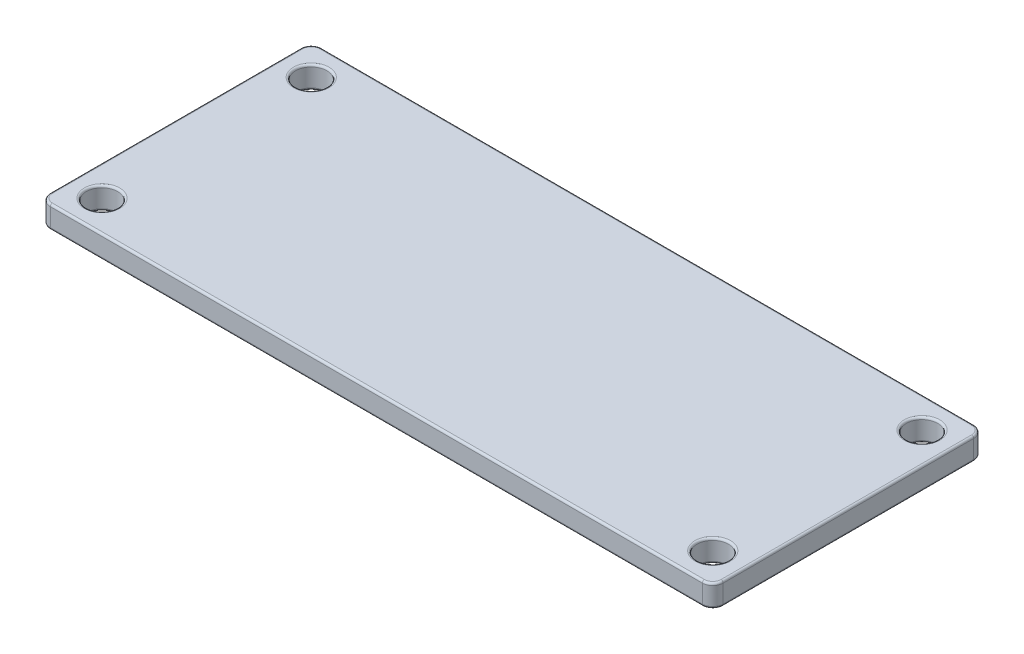
ISO-10303-21;
HEADER;
FILE_DESCRIPTION(('STEP AP214'),'2;1');
FILE_NAME('part.step','',(''),(''),'','','');
FILE_SCHEMA(('AUTOMOTIVE_DESIGN { 1 0 10303 214 1 1 1 1 }'));
ENDSEC;
DATA;
#1=APPLICATION_CONTEXT('core data for automotive mechanical design processes');
#2=APPLICATION_PROTOCOL_DEFINITION('international standard','automotive_design',2000,#1);
#3=PRODUCT_CONTEXT('',#1,'mechanical');
#4=PRODUCT('Part','Part','',(#3));
#5=PRODUCT_RELATED_PRODUCT_CATEGORY('part','',(#4));
#6=PRODUCT_DEFINITION_FORMATION('','',#4);
#7=PRODUCT_DEFINITION_CONTEXT('part definition',#1,'design');
#8=PRODUCT_DEFINITION('design','',#6,#7);
#9=PRODUCT_DEFINITION_SHAPE('','',#8);
#10=(LENGTH_UNIT() NAMED_UNIT(*) SI_UNIT(.MILLI.,.METRE.));
#11=(NAMED_UNIT(*) PLANE_ANGLE_UNIT() SI_UNIT($,.RADIAN.));
#12=(NAMED_UNIT(*) SI_UNIT($,.STERADIAN.) SOLID_ANGLE_UNIT());
#13=UNCERTAINTY_MEASURE_WITH_UNIT(LENGTH_MEASURE(1.E-05),#10,'distance_accuracy_value','');
#14=(GEOMETRIC_REPRESENTATION_CONTEXT(3) GLOBAL_UNCERTAINTY_ASSIGNED_CONTEXT((#13)) GLOBAL_UNIT_ASSIGNED_CONTEXT((#10,
#11,#12)) REPRESENTATION_CONTEXT('',''));
#15=CARTESIAN_POINT('',(0.,0.,0.));
#16=DIRECTION('',(0.,0.,1.));
#17=DIRECTION('',(1.,0.,0.));
#18=AXIS2_PLACEMENT_3D('',#15,#16,#17);
#19=CARTESIAN_POINT('',(-39.5006479750779,2.134,-18.3467476635514));
#20=DIRECTION('',(1.,0.,0.));
#21=DIRECTION('',(0.,0.,-1.));
#22=AXIS2_PLACEMENT_3D('',#19,#20,#21);
#23=PLANE('',#22);
#24=DIRECTION('',(0.,-1.,0.));
#25=VECTOR('',#24,1.);
#26=CARTESIAN_POINT('',(-39.5006479750779,2.134,6.6122523364486));
#27=LINE('',#26,#25);
#28=CARTESIAN_POINT('',(-39.5006479750779,0.2,6.6122523364486));
#29=VERTEX_POINT('',#28);
#30=CARTESIAN_POINT('',(-39.5006479750779,1.934,6.6122523364486));
#31=VERTEX_POINT('',#30);
#32=EDGE_CURVE('E275',#29,#31,#27,.F.);
#33=ORIENTED_EDGE('',*,*,#32,.T.);
#34=DIRECTION('',(0.,0.,1.));
#35=VECTOR('',#34,1.);
#36=CARTESIAN_POINT('',(-39.5006479750779,1.934,-17.3467476635514));
#37=LINE('',#36,#35);
#38=CARTESIAN_POINT('',(-39.5006479750779,1.934,-17.3467476635514));
#39=VERTEX_POINT('',#38);
#40=EDGE_CURVE('E200',#31,#39,#37,.F.);
#41=ORIENTED_EDGE('',*,*,#40,.T.);
#42=DIRECTION('',(0.,-1.,0.));
#43=VECTOR('',#42,1.);
#44=CARTESIAN_POINT('',(-39.5006479750779,2.134,-17.3467476635514));
#45=LINE('',#44,#43);
#46=CARTESIAN_POINT('',(-39.5006479750779,0.2,-17.3467476635514));
#47=VERTEX_POINT('',#46);
#48=EDGE_CURVE('E321',#39,#47,#45,.T.);
#49=ORIENTED_EDGE('',*,*,#48,.T.);
#50=DIRECTION('',(0.,0.,1.));
#51=VECTOR('',#50,1.);
#52=CARTESIAN_POINT('',(-39.5006479750779,0.2,-18.3467476635514));
#53=LINE('',#52,#51);
#54=EDGE_CURVE('E198',#47,#29,#53,.T.);
#55=ORIENTED_EDGE('',*,*,#54,.T.);
#56=EDGE_LOOP('',(#33,#41,#49,#55));
#57=FACE_BOUND('',#56,.T.);
#58=ADVANCED_FACE('F33',(#57),#23,.F.);
#59=CARTESIAN_POINT('',(-39.5006479750779,2.134,7.6122523364486));
#60=DIRECTION('',(0.,0.,-1.));
#61=DIRECTION('',(-1.,0.,0.));
#62=AXIS2_PLACEMENT_3D('',#59,#60,#61);
#63=PLANE('',#62);
#64=DIRECTION('',(0.,-1.,0.));
#65=VECTOR('',#64,1.);
#66=CARTESIAN_POINT('',(23.8633520249221,2.134,7.6122523364486));
#67=LINE('',#66,#65);
#68=CARTESIAN_POINT('',(23.8633520249221,0.2,7.6122523364486));
#69=VERTEX_POINT('',#68);
#70=CARTESIAN_POINT('',(23.8633520249221,1.934,7.6122523364486));
#71=VERTEX_POINT('',#70);
#72=EDGE_CURVE('E323',#69,#71,#67,.F.);
#73=ORIENTED_EDGE('',*,*,#72,.T.);
#74=DIRECTION('',(1.,0.,0.));
#75=VECTOR('',#74,1.);
#76=CARTESIAN_POINT('',(-38.5006479750779,1.934,7.6122523364486));
#77=LINE('',#76,#75);
#78=CARTESIAN_POINT('',(-38.5006479750779,1.934,7.6122523364486));
#79=VERTEX_POINT('',#78);
#80=EDGE_CURVE('E191',#71,#79,#77,.F.);
#81=ORIENTED_EDGE('',*,*,#80,.T.);
#82=DIRECTION('',(0.,-1.,0.));
#83=VECTOR('',#82,1.);
#84=CARTESIAN_POINT('',(-38.5006479750779,2.134,7.6122523364486));
#85=LINE('',#84,#83);
#86=CARTESIAN_POINT('',(-38.5006479750779,0.2,7.6122523364486));
#87=VERTEX_POINT('',#86);
#88=EDGE_CURVE('E331',#79,#87,#85,.T.);
#89=ORIENTED_EDGE('',*,*,#88,.T.);
#90=DIRECTION('',(1.,0.,0.));
#91=VECTOR('',#90,1.);
#92=CARTESIAN_POINT('',(-39.5006479750779,0.2,7.6122523364486));
#93=LINE('',#92,#91);
#94=EDGE_CURVE('E189',#87,#69,#93,.T.);
#95=ORIENTED_EDGE('',*,*,#94,.T.);
#96=EDGE_LOOP('',(#73,#81,#89,#95));
#97=FACE_BOUND('',#96,.T.);
#98=ADVANCED_FACE('F412',(#97),#63,.F.);
#99=CARTESIAN_POINT('',(24.8633520249221,2.134,-18.3467476635514));
#100=DIRECTION('',(-1.,0.,0.));
#101=DIRECTION('',(0.,0.,1.));
#102=AXIS2_PLACEMENT_3D('',#99,#100,#101);
#103=PLANE('',#102);
#104=DIRECTION('',(0.,-1.,0.));
#105=VECTOR('',#104,1.);
#106=CARTESIAN_POINT('',(24.8633520249221,2.134,-17.3467476635514));
#107=LINE('',#106,#105);
#108=CARTESIAN_POINT('',(24.8633520249221,0.2,-17.3467476635514));
#109=VERTEX_POINT('',#108);
#110=CARTESIAN_POINT('',(24.8633520249221,1.934,-17.3467476635514));
#111=VERTEX_POINT('',#110);
#112=EDGE_CURVE('E315',#109,#111,#107,.F.);
#113=ORIENTED_EDGE('',*,*,#112,.T.);
#114=DIRECTION('',(0.,0.,-1.));
#115=VECTOR('',#114,1.);
#116=CARTESIAN_POINT('',(24.8633520249221,1.934,6.61225233644859));
#117=LINE('',#116,#115);
#118=CARTESIAN_POINT('',(24.8633520249221,1.934,6.6122523364486));
#119=VERTEX_POINT('',#118);
#120=EDGE_CURVE('E183',#111,#119,#117,.F.);
#121=ORIENTED_EDGE('',*,*,#120,.T.);
#122=DIRECTION('',(0.,-1.,0.));
#123=VECTOR('',#122,1.);
#124=CARTESIAN_POINT('',(24.8633520249221,2.134,6.6122523364486));
#125=LINE('',#124,#123);
#126=CARTESIAN_POINT('',(24.8633520249221,0.2,6.6122523364486));
#127=VERTEX_POINT('',#126);
#128=EDGE_CURVE('E334',#119,#127,#125,.T.);
#129=ORIENTED_EDGE('',*,*,#128,.T.);
#130=DIRECTION('',(0.,0.,-1.));
#131=VECTOR('',#130,1.);
#132=CARTESIAN_POINT('',(24.8633520249221,0.2,-18.3467476635514));
#133=LINE('',#132,#131);
#134=EDGE_CURVE('E181',#127,#109,#133,.T.);
#135=ORIENTED_EDGE('',*,*,#134,.T.);
#136=EDGE_LOOP('',(#113,#121,#129,#135));
#137=FACE_BOUND('',#136,.T.);
#138=ADVANCED_FACE('F367',(#137),#103,.F.);
#139=CARTESIAN_POINT('',(-39.5006479750779,2.134,-18.3467476635514));
#140=DIRECTION('',(0.,0.,1.));
#141=DIRECTION('',(1.,0.,0.));
#142=AXIS2_PLACEMENT_3D('',#139,#140,#141);
#143=PLANE('',#142);
#144=DIRECTION('',(0.,-1.,0.));
#145=VECTOR('',#144,1.);
#146=CARTESIAN_POINT('',(-38.5006479750779,2.134,-18.3467476635514));
#147=LINE('',#146,#145);
#148=CARTESIAN_POINT('',(-38.5006479750779,0.2,-18.3467476635514));
#149=VERTEX_POINT('',#148);
#150=CARTESIAN_POINT('',(-38.5006479750779,1.934,-18.3467476635514));
#151=VERTEX_POINT('',#150);
#152=EDGE_CURVE('E320',#149,#151,#147,.F.);
#153=ORIENTED_EDGE('',*,*,#152,.T.);
#154=DIRECTION('',(-1.,0.,0.));
#155=VECTOR('',#154,1.);
#156=CARTESIAN_POINT('',(23.8633520249221,1.934,-18.3467476635514));
#157=LINE('',#156,#155);
#158=CARTESIAN_POINT('',(23.8633520249221,1.934,-18.3467476635514));
#159=VERTEX_POINT('',#158);
#160=EDGE_CURVE('E208',#151,#159,#157,.F.);
#161=ORIENTED_EDGE('',*,*,#160,.T.);
#162=DIRECTION('',(0.,-1.,0.));
#163=VECTOR('',#162,1.);
#164=CARTESIAN_POINT('',(23.8633520249221,2.134,-18.3467476635514));
#165=LINE('',#164,#163);
#166=CARTESIAN_POINT('',(23.8633520249221,0.2,-18.3467476635514));
#167=VERTEX_POINT('',#166);
#168=EDGE_CURVE('E313',#159,#167,#165,.T.);
#169=ORIENTED_EDGE('',*,*,#168,.T.);
#170=DIRECTION('',(-1.,0.,0.));
#171=VECTOR('',#170,1.);
#172=CARTESIAN_POINT('',(-39.5006479750779,0.2,-18.3467476635514));
#173=LINE('',#172,#171);
#174=EDGE_CURVE('E206',#167,#149,#173,.T.);
#175=ORIENTED_EDGE('',*,*,#174,.T.);
#176=EDGE_LOOP('',(#153,#161,#169,#175));
#177=FACE_BOUND('',#176,.T.);
#178=ADVANCED_FACE('F318',(#177),#143,.F.);
#179=CARTESIAN_POINT('',(0.,2.134,0.));
#180=DIRECTION('',(0.,1.,0.));
#181=DIRECTION('',(0.,0.,1.));
#182=AXIS2_PLACEMENT_3D('',#179,#180,#181);
#183=PLANE('',#182);
#184=DIRECTION('',(0.,0.,-1.));
#185=VECTOR('',#184,1.);
#186=CARTESIAN_POINT('',(24.6633520249221,2.134,-17.3467476635514));
#187=LINE('',#186,#185);
#188=CARTESIAN_POINT('',(24.6633520249221,2.134,6.6122523364486));
#189=VERTEX_POINT('',#188);
#190=CARTESIAN_POINT('',(24.6633520249221,2.134,-17.3467476635514));
#191=VERTEX_POINT('',#190);
#192=EDGE_CURVE('E171',#189,#191,#187,.T.);
#193=ORIENTED_EDGE('',*,*,#192,.T.);
#194=CARTESIAN_POINT('',(23.8633520249221,2.134,-17.3467476635514));
#195=DIRECTION('',(0.,1.,0.));
#196=DIRECTION('',(0.,0.,1.));
#197=AXIS2_PLACEMENT_3D('',#194,#195,#196);
#198=CIRCLE('',#197,0.8);
#199=CARTESIAN_POINT('',(23.8633520249221,2.134,-18.1467476635514));
#200=VERTEX_POINT('',#199);
#201=EDGE_CURVE('E151',#191,#200,#198,.T.);
#202=ORIENTED_EDGE('',*,*,#201,.T.);
#203=DIRECTION('',(-1.,0.,0.));
#204=VECTOR('',#203,1.);
#205=CARTESIAN_POINT('',(-38.5006479750779,2.134,-18.1467476635514));
#206=LINE('',#205,#204);
#207=CARTESIAN_POINT('',(-38.5006479750779,2.134,-18.1467476635514));
#208=VERTEX_POINT('',#207);
#209=EDGE_CURVE('E159',#200,#208,#206,.T.);
#210=ORIENTED_EDGE('',*,*,#209,.T.);
#211=CARTESIAN_POINT('',(-38.5006479750779,2.134,-17.3467476635514));
#212=DIRECTION('',(0.,1.,0.));
#213=DIRECTION('',(0.,0.,1.));
#214=AXIS2_PLACEMENT_3D('',#211,#212,#213);
#215=CIRCLE('',#214,0.8);
#216=CARTESIAN_POINT('',(-39.3006479750779,2.134,-17.3467476635514));
#217=VERTEX_POINT('',#216);
#218=EDGE_CURVE('E165',#208,#217,#215,.T.);
#219=ORIENTED_EDGE('',*,*,#218,.T.);
#220=DIRECTION('',(0.,0.,1.));
#221=VECTOR('',#220,1.);
#222=CARTESIAN_POINT('',(-39.3006479750779,2.134,6.61225233644859));
#223=LINE('',#222,#221);
#224=CARTESIAN_POINT('',(-39.3006479750779,2.134,6.6122523364486));
#225=VERTEX_POINT('',#224);
#226=EDGE_CURVE('E350',#217,#225,#223,.T.);
#227=ORIENTED_EDGE('',*,*,#226,.T.);
#228=CARTESIAN_POINT('',(-38.5006479750779,2.134,6.6122523364486));
#229=DIRECTION('',(0.,1.,0.));
#230=DIRECTION('',(0.,0.,1.));
#231=AXIS2_PLACEMENT_3D('',#228,#229,#230);
#232=CIRCLE('',#231,0.8);
#233=CARTESIAN_POINT('',(-38.5006479750779,2.134,7.4122523364486));
#234=VERTEX_POINT('',#233);
#235=EDGE_CURVE('E352',#225,#234,#232,.T.);
#236=ORIENTED_EDGE('',*,*,#235,.T.);
#237=DIRECTION('',(1.,0.,0.));
#238=VECTOR('',#237,1.);
#239=CARTESIAN_POINT('',(23.8633520249221,2.134,7.4122523364486));
#240=LINE('',#239,#238);
#241=CARTESIAN_POINT('',(23.8633520249221,2.134,7.4122523364486));
#242=VERTEX_POINT('',#241);
#243=EDGE_CURVE('E354',#234,#242,#240,.T.);
#244=ORIENTED_EDGE('',*,*,#243,.T.);
#245=CARTESIAN_POINT('',(23.8633520249221,2.134,6.6122523364486));
#246=DIRECTION('',(0.,1.,0.));
#247=DIRECTION('',(0.,0.,1.));
#248=AXIS2_PLACEMENT_3D('',#245,#246,#247);
#249=CIRCLE('',#248,0.8);
#250=EDGE_CURVE('E176',#242,#189,#249,.T.);
#251=ORIENTED_EDGE('',*,*,#250,.T.);
#252=EDGE_LOOP('',(#193,#202,#210,#219,#227,#236,#244,#251));
#253=FACE_BOUND('',#252,.T.);
#254=CARTESIAN_POINT('',(21.8913520249221,2.134,4.6402523364486));
#255=DIRECTION('',(0.,1.,0.));
#256=DIRECTION('',(0.,0.,1.));
#257=AXIS2_PLACEMENT_3D('',#254,#255,#256);
#258=CIRCLE('',#257,1.7);
#259=CARTESIAN_POINT('',(21.8913520249221,2.134,6.3402523364486));
#260=VERTEX_POINT('',#259);
#261=EDGE_CURVE('E166',#260,#260,#258,.F.);
#262=ORIENTED_EDGE('',*,*,#261,.T.);
#263=EDGE_LOOP('',(#262));
#264=FACE_BOUND('',#263,.T.);
#265=CARTESIAN_POINT('',(21.8913520249221,2.134,-15.3747476635514));
#266=DIRECTION('',(0.,1.,0.));
#267=DIRECTION('',(0.,0.,1.));
#268=AXIS2_PLACEMENT_3D('',#265,#266,#267);
#269=CIRCLE('',#268,1.7);
#270=CARTESIAN_POINT('',(21.8913520249221,2.134,-13.6747476635514));
#271=VERTEX_POINT('',#270);
#272=EDGE_CURVE('E344',#271,#271,#269,.F.);
#273=ORIENTED_EDGE('',*,*,#272,.T.);
#274=EDGE_LOOP('',(#273));
#275=FACE_BOUND('',#274,.T.);
#276=CARTESIAN_POINT('',(-36.5286479750779,2.134,-15.3747476635514));
#277=DIRECTION('',(0.,1.,0.));
#278=DIRECTION('',(0.,0.,1.));
#279=AXIS2_PLACEMENT_3D('',#276,#277,#278);
#280=CIRCLE('',#279,1.7);
#281=CARTESIAN_POINT('',(-36.5286479750779,2.134,-13.6747476635514));
#282=VERTEX_POINT('',#281);
#283=EDGE_CURVE('E341',#282,#282,#280,.F.);
#284=ORIENTED_EDGE('',*,*,#283,.T.);
#285=EDGE_LOOP('',(#284));
#286=FACE_BOUND('',#285,.T.);
#287=CARTESIAN_POINT('',(-36.5286479750779,2.134,4.6402523364486));
#288=DIRECTION('',(0.,1.,0.));
#289=DIRECTION('',(0.,0.,1.));
#290=AXIS2_PLACEMENT_3D('',#287,#288,#289);
#291=CIRCLE('',#290,1.7);
#292=CARTESIAN_POINT('',(-36.5286479750779,2.134,6.34025233644861));
#293=VERTEX_POINT('',#292);
#294=EDGE_CURVE('E338',#293,#293,#291,.F.);
#295=ORIENTED_EDGE('',*,*,#294,.T.);
#296=EDGE_LOOP('',(#295));
#297=FACE_BOUND('',#296,.T.);
#298=ADVANCED_FACE('F168',(#253,#264,#275,#286,#297),#183,.T.);
#299=CARTESIAN_POINT('',(0.,0.,0.));
#300=DIRECTION('',(0.,1.,0.));
#301=DIRECTION('',(0.,0.,1.));
#302=AXIS2_PLACEMENT_3D('',#299,#300,#301);
#303=PLANE('',#302);
#304=DIRECTION('',(1.,0.,0.));
#305=VECTOR('',#304,1.);
#306=CARTESIAN_POINT('',(0.,0.,7.4122523364486));
#307=LINE('',#306,#305);
#308=CARTESIAN_POINT('',(23.8633520249221,0.,7.4122523364486));
#309=VERTEX_POINT('',#308);
#310=CARTESIAN_POINT('',(-38.5006479750779,0.,7.4122523364486));
#311=VERTEX_POINT('',#310);
#312=EDGE_CURVE('E42',#309,#311,#307,.F.);
#313=ORIENTED_EDGE('',*,*,#312,.T.);
#314=CARTESIAN_POINT('',(-38.5006479750779,0.,6.6122523364486));
#315=DIRECTION('',(0.,1.,0.));
#316=DIRECTION('',(0.,0.,1.));
#317=AXIS2_PLACEMENT_3D('',#314,#315,#316);
#318=CIRCLE('',#317,0.8);
#319=CARTESIAN_POINT('',(-39.3006479750779,0.,6.6122523364486));
#320=VERTEX_POINT('',#319);
#321=EDGE_CURVE('E11',#311,#320,#318,.F.);
#322=ORIENTED_EDGE('',*,*,#321,.T.);
#323=DIRECTION('',(0.,0.,1.));
#324=VECTOR('',#323,1.);
#325=CARTESIAN_POINT('',(-39.3006479750779,0.,0.));
#326=LINE('',#325,#324);
#327=CARTESIAN_POINT('',(-39.3006479750779,0.,-17.3467476635514));
#328=VERTEX_POINT('',#327);
#329=EDGE_CURVE('E246',#320,#328,#326,.F.);
#330=ORIENTED_EDGE('',*,*,#329,.T.);
#331=CARTESIAN_POINT('',(-38.5006479750779,0.,-17.3467476635514));
#332=DIRECTION('',(0.,1.,0.));
#333=DIRECTION('',(0.,0.,1.));
#334=AXIS2_PLACEMENT_3D('',#331,#332,#333);
#335=CIRCLE('',#334,0.8);
#336=CARTESIAN_POINT('',(-38.5006479750779,0.,-18.1467476635514));
#337=VERTEX_POINT('',#336);
#338=EDGE_CURVE('E248',#328,#337,#335,.F.);
#339=ORIENTED_EDGE('',*,*,#338,.T.);
#340=DIRECTION('',(-1.,0.,0.));
#341=VECTOR('',#340,1.);
#342=CARTESIAN_POINT('',(0.,0.,-18.1467476635514));
#343=LINE('',#342,#341);
#344=CARTESIAN_POINT('',(23.8633520249221,0.,-18.1467476635514));
#345=VERTEX_POINT('',#344);
#346=EDGE_CURVE('E250',#337,#345,#343,.F.);
#347=ORIENTED_EDGE('',*,*,#346,.T.);
#348=CARTESIAN_POINT('',(23.8633520249221,0.,-17.3467476635514));
#349=DIRECTION('',(0.,1.,0.));
#350=DIRECTION('',(0.,0.,1.));
#351=AXIS2_PLACEMENT_3D('',#348,#349,#350);
#352=CIRCLE('',#351,0.8);
#353=CARTESIAN_POINT('',(24.6633520249221,0.,-17.3467476635514));
#354=VERTEX_POINT('',#353);
#355=EDGE_CURVE('E252',#345,#354,#352,.F.);
#356=ORIENTED_EDGE('',*,*,#355,.T.);
#357=DIRECTION('',(0.,0.,-1.));
#358=VECTOR('',#357,1.);
#359=CARTESIAN_POINT('',(24.6633520249221,0.,0.));
#360=LINE('',#359,#358);
#361=CARTESIAN_POINT('',(24.6633520249221,0.,6.6122523364486));
#362=VERTEX_POINT('',#361);
#363=EDGE_CURVE('E254',#354,#362,#360,.F.);
#364=ORIENTED_EDGE('',*,*,#363,.T.);
#365=CARTESIAN_POINT('',(23.8633520249221,0.,6.6122523364486));
#366=DIRECTION('',(0.,1.,0.));
#367=DIRECTION('',(0.,0.,1.));
#368=AXIS2_PLACEMENT_3D('',#365,#366,#367);
#369=CIRCLE('',#368,0.8);
#370=EDGE_CURVE('E53',#362,#309,#369,.F.);
#371=ORIENTED_EDGE('',*,*,#370,.T.);
#372=EDGE_LOOP('',(#313,#322,#330,#339,#347,#356,#364,#371));
#373=FACE_BOUND('',#372,.T.);
#374=CARTESIAN_POINT('',(21.8913520249221,0.,4.6402523364486));
#375=DIRECTION('',(0.,1.,0.));
#376=DIRECTION('',(0.,0.,1.));
#377=AXIS2_PLACEMENT_3D('',#374,#375,#376);
#378=CIRCLE('',#377,1.7);
#379=CARTESIAN_POINT('',(21.8913520249221,0.,6.3402523364486));
#380=VERTEX_POINT('',#379);
#381=EDGE_CURVE('E243',#380,#380,#378,.T.);
#382=ORIENTED_EDGE('',*,*,#381,.T.);
#383=EDGE_LOOP('',(#382));
#384=FACE_BOUND('',#383,.T.);
#385=CARTESIAN_POINT('',(21.8913520249221,0.,-15.3747476635514));
#386=DIRECTION('',(0.,1.,0.));
#387=DIRECTION('',(0.,0.,1.));
#388=AXIS2_PLACEMENT_3D('',#385,#386,#387);
#389=CIRCLE('',#388,1.7);
#390=CARTESIAN_POINT('',(21.8913520249221,0.,-13.6747476635514));
#391=VERTEX_POINT('',#390);
#392=EDGE_CURVE('E240',#391,#391,#389,.T.);
#393=ORIENTED_EDGE('',*,*,#392,.T.);
#394=EDGE_LOOP('',(#393));
#395=FACE_BOUND('',#394,.T.);
#396=CARTESIAN_POINT('',(-36.5286479750779,0.,-15.3747476635514));
#397=DIRECTION('',(0.,1.,0.));
#398=DIRECTION('',(0.,0.,1.));
#399=AXIS2_PLACEMENT_3D('',#396,#397,#398);
#400=CIRCLE('',#399,1.7);
#401=CARTESIAN_POINT('',(-36.5286479750779,0.,-13.6747476635514));
#402=VERTEX_POINT('',#401);
#403=EDGE_CURVE('E237',#402,#402,#400,.T.);
#404=ORIENTED_EDGE('',*,*,#403,.T.);
#405=EDGE_LOOP('',(#404));
#406=FACE_BOUND('',#405,.T.);
#407=CARTESIAN_POINT('',(-36.5286479750779,0.,4.6402523364486));
#408=DIRECTION('',(0.,1.,0.));
#409=DIRECTION('',(0.,0.,1.));
#410=AXIS2_PLACEMENT_3D('',#407,#408,#409);
#411=CIRCLE('',#410,1.7);
#412=CARTESIAN_POINT('',(-36.5286479750779,0.,6.34025233644861));
#413=VERTEX_POINT('',#412);
#414=EDGE_CURVE('E234',#413,#413,#411,.T.);
#415=ORIENTED_EDGE('',*,*,#414,.T.);
#416=EDGE_LOOP('',(#415));
#417=FACE_BOUND('',#416,.T.);
#418=ADVANCED_FACE('F383',(#373,#384,#395,#406,#417),#303,.F.);
#419=CARTESIAN_POINT('',(-38.5006479750779,2.134,-17.3467476635514));
#420=DIRECTION('',(0.,-1.,0.));
#421=DIRECTION('',(0.,0.,-1.));
#422=AXIS2_PLACEMENT_3D('',#419,#420,#421);
#423=CYLINDRICAL_SURFACE('',#422,1.);
#424=ORIENTED_EDGE('',*,*,#48,.F.);
#425=CARTESIAN_POINT('',(-38.5006479750779,1.934,-17.3467476635514));
#426=DIRECTION('',(0.,1.,0.));
#427=DIRECTION('',(0.,0.,1.));
#428=AXIS2_PLACEMENT_3D('',#425,#426,#427);
#429=CIRCLE('',#428,1.);
#430=EDGE_CURVE('E204',#39,#151,#429,.F.);
#431=ORIENTED_EDGE('',*,*,#430,.T.);
#432=ORIENTED_EDGE('',*,*,#152,.F.);
#433=CARTESIAN_POINT('',(-38.5006479750779,0.2,-17.3467476635514));
#434=DIRECTION('',(0.,1.,0.));
#435=DIRECTION('',(0.,0.,1.));
#436=AXIS2_PLACEMENT_3D('',#433,#434,#435);
#437=CIRCLE('',#436,1.);
#438=EDGE_CURVE('E202',#149,#47,#437,.T.);
#439=ORIENTED_EDGE('',*,*,#438,.T.);
#440=EDGE_LOOP('',(#424,#431,#432,#439));
#441=FACE_BOUND('',#440,.T.);
#442=ADVANCED_FACE('F423',(#441),#423,.T.);
#443=CARTESIAN_POINT('',(-38.5006479750779,2.134,6.6122523364486));
#444=DIRECTION('',(0.,-1.,0.));
#445=DIRECTION('',(0.,0.,-1.));
#446=AXIS2_PLACEMENT_3D('',#443,#444,#445);
#447=CYLINDRICAL_SURFACE('',#446,1.);
#448=ORIENTED_EDGE('',*,*,#88,.F.);
#449=CARTESIAN_POINT('',(-38.5006479750779,1.934,6.6122523364486));
#450=DIRECTION('',(0.,1.,0.));
#451=DIRECTION('',(0.,0.,1.));
#452=AXIS2_PLACEMENT_3D('',#449,#450,#451);
#453=CIRCLE('',#452,1.);
#454=EDGE_CURVE('E196',#79,#31,#453,.F.);
#455=ORIENTED_EDGE('',*,*,#454,.T.);
#456=ORIENTED_EDGE('',*,*,#32,.F.);
#457=CARTESIAN_POINT('',(-38.5006479750779,0.2,6.6122523364486));
#458=DIRECTION('',(0.,1.,0.));
#459=DIRECTION('',(0.,0.,1.));
#460=AXIS2_PLACEMENT_3D('',#457,#458,#459);
#461=CIRCLE('',#460,1.);
#462=EDGE_CURVE('E193',#29,#87,#461,.T.);
#463=ORIENTED_EDGE('',*,*,#462,.T.);
#464=EDGE_LOOP('',(#448,#455,#456,#463));
#465=FACE_BOUND('',#464,.T.);
#466=ADVANCED_FACE('F401',(#465),#447,.T.);
#467=CARTESIAN_POINT('',(23.8633520249221,2.134,-17.3467476635514));
#468=DIRECTION('',(0.,-1.,0.));
#469=DIRECTION('',(0.,0.,-1.));
#470=AXIS2_PLACEMENT_3D('',#467,#468,#469);
#471=CYLINDRICAL_SURFACE('',#470,1.);
#472=ORIENTED_EDGE('',*,*,#168,.F.);
#473=CARTESIAN_POINT('',(23.8633520249221,1.934,-17.3467476635514));
#474=DIRECTION('',(0.,1.,0.));
#475=DIRECTION('',(0.,0.,1.));
#476=AXIS2_PLACEMENT_3D('',#473,#474,#475);
#477=CIRCLE('',#476,1.);
#478=EDGE_CURVE('E153',#159,#111,#477,.F.);
#479=ORIENTED_EDGE('',*,*,#478,.T.);
#480=ORIENTED_EDGE('',*,*,#112,.F.);
#481=CARTESIAN_POINT('',(23.8633520249221,0.2,-17.3467476635514));
#482=DIRECTION('',(0.,1.,0.));
#483=DIRECTION('',(0.,0.,1.));
#484=AXIS2_PLACEMENT_3D('',#481,#482,#483);
#485=CIRCLE('',#484,1.);
#486=EDGE_CURVE('E173',#109,#167,#485,.T.);
#487=ORIENTED_EDGE('',*,*,#486,.T.);
#488=EDGE_LOOP('',(#472,#479,#480,#487));
#489=FACE_BOUND('',#488,.T.);
#490=ADVANCED_FACE('F312',(#489),#471,.T.);
#491=CARTESIAN_POINT('',(23.8633520249221,2.134,6.6122523364486));
#492=DIRECTION('',(0.,-1.,0.));
#493=DIRECTION('',(0.,0.,-1.));
#494=AXIS2_PLACEMENT_3D('',#491,#492,#493);
#495=CYLINDRICAL_SURFACE('',#494,1.);
#496=ORIENTED_EDGE('',*,*,#128,.F.);
#497=CARTESIAN_POINT('',(23.8633520249221,1.934,6.6122523364486));
#498=DIRECTION('',(0.,1.,0.));
#499=DIRECTION('',(0.,0.,1.));
#500=AXIS2_PLACEMENT_3D('',#497,#498,#499);
#501=CIRCLE('',#500,1.);
#502=EDGE_CURVE('E187',#119,#71,#501,.F.);
#503=ORIENTED_EDGE('',*,*,#502,.T.);
#504=ORIENTED_EDGE('',*,*,#72,.F.);
#505=CARTESIAN_POINT('',(23.8633520249221,0.2,6.6122523364486));
#506=DIRECTION('',(0.,1.,0.));
#507=DIRECTION('',(0.,0.,1.));
#508=AXIS2_PLACEMENT_3D('',#505,#506,#507);
#509=CIRCLE('',#508,1.);
#510=EDGE_CURVE('E185',#69,#127,#509,.T.);
#511=ORIENTED_EDGE('',*,*,#510,.T.);
#512=EDGE_LOOP('',(#496,#503,#504,#511));
#513=FACE_BOUND('',#512,.T.);
#514=ADVANCED_FACE('F369',(#513),#495,.T.);
#515=CARTESIAN_POINT('',(21.8913520249221,2.134,4.6402523364486));
#516=DIRECTION('',(0.,-1.,0.));
#517=DIRECTION('',(0.,0.,-1.));
#518=AXIS2_PLACEMENT_3D('',#515,#516,#517);
#519=CYLINDRICAL_SURFACE('',#518,1.5);
#520=CARTESIAN_POINT('',(21.8913520249221,1.934,4.6402523364486));
#521=DIRECTION('',(0.,1.,0.));
#522=DIRECTION('',(0.,0.,1.));
#523=AXIS2_PLACEMENT_3D('',#520,#521,#522);
#524=CIRCLE('',#523,1.5);
#525=CARTESIAN_POINT('',(21.8913520249221,1.934,6.1402523364486));
#526=VERTEX_POINT('',#525);
#527=EDGE_CURVE('E213',#526,#526,#524,.T.);
#528=ORIENTED_EDGE('',*,*,#527,.T.);
#529=EDGE_LOOP('',(#528));
#530=FACE_BOUND('',#529,.T.);
#531=CARTESIAN_POINT('',(21.8913520249221,0.2,4.6402523364486));
#532=DIRECTION('',(0.,1.,0.));
#533=DIRECTION('',(0.,0.,1.));
#534=AXIS2_PLACEMENT_3D('',#531,#532,#533);
#535=CIRCLE('',#534,1.5);
#536=CARTESIAN_POINT('',(21.8913520249221,0.2,6.1402523364486));
#537=VERTEX_POINT('',#536);
#538=EDGE_CURVE('E210',#537,#537,#535,.F.);
#539=ORIENTED_EDGE('',*,*,#538,.T.);
#540=EDGE_LOOP('',(#539));
#541=FACE_BOUND('',#540,.T.);
#542=ADVANCED_FACE('F433',(#530,#541),#519,.F.);
#543=CARTESIAN_POINT('',(21.8913520249221,2.134,-15.3747476635514));
#544=DIRECTION('',(0.,-1.,0.));
#545=DIRECTION('',(0.,0.,-1.));
#546=AXIS2_PLACEMENT_3D('',#543,#544,#545);
#547=CYLINDRICAL_SURFACE('',#546,1.5);
#548=CARTESIAN_POINT('',(21.8913520249221,1.934,-15.3747476635514));
#549=DIRECTION('',(0.,1.,0.));
#550=DIRECTION('',(0.,0.,1.));
#551=AXIS2_PLACEMENT_3D('',#548,#549,#550);
#552=CIRCLE('',#551,1.5);
#553=CARTESIAN_POINT('',(21.8913520249221,1.934,-13.8747476635514));
#554=VERTEX_POINT('',#553);
#555=EDGE_CURVE('E219',#554,#554,#552,.T.);
#556=ORIENTED_EDGE('',*,*,#555,.T.);
#557=EDGE_LOOP('',(#556));
#558=FACE_BOUND('',#557,.T.);
#559=CARTESIAN_POINT('',(21.8913520249221,0.2,-15.3747476635514));
#560=DIRECTION('',(0.,1.,0.));
#561=DIRECTION('',(0.,0.,1.));
#562=AXIS2_PLACEMENT_3D('',#559,#560,#561);
#563=CIRCLE('',#562,1.5);
#564=CARTESIAN_POINT('',(21.8913520249221,0.2,-13.8747476635514));
#565=VERTEX_POINT('',#564);
#566=EDGE_CURVE('E216',#565,#565,#563,.F.);
#567=ORIENTED_EDGE('',*,*,#566,.T.);
#568=EDGE_LOOP('',(#567));
#569=FACE_BOUND('',#568,.T.);
#570=ADVANCED_FACE('F508',(#558,#569),#547,.F.);
#571=CARTESIAN_POINT('',(-36.5286479750779,2.134,-15.3747476635514));
#572=DIRECTION('',(0.,-1.,0.));
#573=DIRECTION('',(0.,0.,-1.));
#574=AXIS2_PLACEMENT_3D('',#571,#572,#573);
#575=CYLINDRICAL_SURFACE('',#574,1.5);
#576=CARTESIAN_POINT('',(-36.5286479750779,1.934,-15.3747476635514));
#577=DIRECTION('',(0.,1.,0.));
#578=DIRECTION('',(0.,0.,1.));
#579=AXIS2_PLACEMENT_3D('',#576,#577,#578);
#580=CIRCLE('',#579,1.5);
#581=CARTESIAN_POINT('',(-36.5286479750779,1.934,-13.8747476635514));
#582=VERTEX_POINT('',#581);
#583=EDGE_CURVE('E225',#582,#582,#580,.T.);
#584=ORIENTED_EDGE('',*,*,#583,.T.);
#585=EDGE_LOOP('',(#584));
#586=FACE_BOUND('',#585,.T.);
#587=CARTESIAN_POINT('',(-36.5286479750779,0.2,-15.3747476635514));
#588=DIRECTION('',(0.,1.,0.));
#589=DIRECTION('',(0.,0.,1.));
#590=AXIS2_PLACEMENT_3D('',#587,#588,#589);
#591=CIRCLE('',#590,1.5);
#592=CARTESIAN_POINT('',(-36.5286479750779,0.2,-13.8747476635514));
#593=VERTEX_POINT('',#592);
#594=EDGE_CURVE('E222',#593,#593,#591,.F.);
#595=ORIENTED_EDGE('',*,*,#594,.T.);
#596=EDGE_LOOP('',(#595));
#597=FACE_BOUND('',#596,.T.);
#598=ADVANCED_FACE('F506',(#586,#597),#575,.F.);
#599=CARTESIAN_POINT('',(-36.5286479750779,2.134,4.6402523364486));
#600=DIRECTION('',(0.,-1.,0.));
#601=DIRECTION('',(0.,0.,-1.));
#602=AXIS2_PLACEMENT_3D('',#599,#600,#601);
#603=CYLINDRICAL_SURFACE('',#602,1.5);
#604=CARTESIAN_POINT('',(-36.5286479750779,1.934,4.6402523364486));
#605=DIRECTION('',(0.,1.,0.));
#606=DIRECTION('',(0.,0.,1.));
#607=AXIS2_PLACEMENT_3D('',#604,#605,#606);
#608=CIRCLE('',#607,1.5);
#609=CARTESIAN_POINT('',(-36.5286479750779,1.934,6.14025233644861));
#610=VERTEX_POINT('',#609);
#611=EDGE_CURVE('E231',#610,#610,#608,.T.);
#612=ORIENTED_EDGE('',*,*,#611,.T.);
#613=EDGE_LOOP('',(#612));
#614=FACE_BOUND('',#613,.T.);
#615=CARTESIAN_POINT('',(-36.5286479750779,0.2,4.6402523364486));
#616=DIRECTION('',(0.,1.,0.));
#617=DIRECTION('',(0.,0.,1.));
#618=AXIS2_PLACEMENT_3D('',#615,#616,#617);
#619=CIRCLE('',#618,1.5);
#620=CARTESIAN_POINT('',(-36.5286479750779,0.2,6.14025233644861));
#621=VERTEX_POINT('',#620);
#622=EDGE_CURVE('E228',#621,#621,#619,.F.);
#623=ORIENTED_EDGE('',*,*,#622,.T.);
#624=EDGE_LOOP('',(#623));
#625=FACE_BOUND('',#624,.T.);
#626=ADVANCED_FACE('F455',(#614,#625),#603,.F.);
#627=CARTESIAN_POINT('',(-38.5006479750779,1.934,6.6122523364486));
#628=DIRECTION('',(0.,1.,0.));
#629=DIRECTION('',(0.,0.,1.));
#630=AXIS2_PLACEMENT_3D('',#627,#628,#629);
#631=TOROIDAL_SURFACE('',#630,0.8,0.2);
#632=CARTESIAN_POINT('',(-39.3006479750779,1.934,6.6122523364486));
#633=DIRECTION('',(0.,0.,-1.));
#634=DIRECTION('',(-1.,0.,0.));
#635=AXIS2_PLACEMENT_3D('',#632,#633,#634);
#636=CIRCLE('',#635,0.2);
#637=EDGE_CURVE('E269',#31,#225,#636,.T.);
#638=ORIENTED_EDGE('',*,*,#637,.F.);
#639=ORIENTED_EDGE('',*,*,#454,.F.);
#640=CARTESIAN_POINT('',(-38.5006479750779,1.934,7.4122523364486));
#641=DIRECTION('',(1.,0.,0.));
#642=DIRECTION('',(0.,0.,-1.));
#643=AXIS2_PLACEMENT_3D('',#640,#641,#642);
#644=CIRCLE('',#643,0.2);
#645=EDGE_CURVE('E272',#234,#79,#644,.T.);
#646=ORIENTED_EDGE('',*,*,#645,.F.);
#647=ORIENTED_EDGE('',*,*,#235,.F.);
#648=EDGE_LOOP('',(#638,#639,#646,#647));
#649=FACE_BOUND('',#648,.T.);
#650=ADVANCED_FACE('F405',(#649),#631,.T.);
#651=CARTESIAN_POINT('',(0.,1.934,7.4122523364486));
#652=DIRECTION('',(-1.,0.,0.));
#653=DIRECTION('',(0.,0.,1.));
#654=AXIS2_PLACEMENT_3D('',#651,#652,#653);
#655=CYLINDRICAL_SURFACE('',#654,0.2);
#656=ORIENTED_EDGE('',*,*,#645,.T.);
#657=ORIENTED_EDGE('',*,*,#80,.F.);
#658=CARTESIAN_POINT('',(23.8633520249221,1.934,7.4122523364486));
#659=DIRECTION('',(1.,0.,0.));
#660=DIRECTION('',(0.,0.,-1.));
#661=AXIS2_PLACEMENT_3D('',#658,#659,#660);
#662=CIRCLE('',#661,0.2);
#663=EDGE_CURVE('E266',#242,#71,#662,.T.);
#664=ORIENTED_EDGE('',*,*,#663,.F.);
#665=ORIENTED_EDGE('',*,*,#243,.F.);
#666=EDGE_LOOP('',(#656,#657,#664,#665));
#667=FACE_BOUND('',#666,.T.);
#668=ADVANCED_FACE('F410',(#667),#655,.T.);
#669=CARTESIAN_POINT('',(-39.3006479750779,1.934,0.));
#670=DIRECTION('',(0.,0.,-1.));
#671=DIRECTION('',(-1.,0.,0.));
#672=AXIS2_PLACEMENT_3D('',#669,#670,#671);
#673=CYLINDRICAL_SURFACE('',#672,0.2);
#674=ORIENTED_EDGE('',*,*,#637,.T.);
#675=ORIENTED_EDGE('',*,*,#226,.F.);
#676=CARTESIAN_POINT('',(-39.3006479750779,1.934,-17.3467476635514));
#677=DIRECTION('',(0.,0.,-1.));
#678=DIRECTION('',(-1.,0.,0.));
#679=AXIS2_PLACEMENT_3D('',#676,#677,#678);
#680=CIRCLE('',#679,0.2);
#681=EDGE_CURVE('E263',#39,#217,#680,.T.);
#682=ORIENTED_EDGE('',*,*,#681,.F.);
#683=ORIENTED_EDGE('',*,*,#40,.F.);
#684=EDGE_LOOP('',(#674,#675,#682,#683));
#685=FACE_BOUND('',#684,.T.);
#686=ADVANCED_FACE('F447',(#685),#673,.T.);
#687=CARTESIAN_POINT('',(23.8633520249221,1.934,6.6122523364486));
#688=DIRECTION('',(0.,1.,0.));
#689=DIRECTION('',(0.,0.,1.));
#690=AXIS2_PLACEMENT_3D('',#687,#688,#689);
#691=TOROIDAL_SURFACE('',#690,0.8,0.2);
#692=ORIENTED_EDGE('',*,*,#663,.T.);
#693=ORIENTED_EDGE('',*,*,#502,.F.);
#694=CARTESIAN_POINT('',(24.6633520249221,1.934,6.6122523364486));
#695=DIRECTION('',(0.,0.,-1.));
#696=DIRECTION('',(-1.,0.,0.));
#697=AXIS2_PLACEMENT_3D('',#694,#695,#696);
#698=CIRCLE('',#697,0.2);
#699=EDGE_CURVE('E260',#189,#119,#698,.T.);
#700=ORIENTED_EDGE('',*,*,#699,.F.);
#701=ORIENTED_EDGE('',*,*,#250,.F.);
#702=EDGE_LOOP('',(#692,#693,#700,#701));
#703=FACE_BOUND('',#702,.T.);
#704=ADVANCED_FACE('F361',(#703),#691,.T.);
#705=CARTESIAN_POINT('',(-38.5006479750779,1.934,-17.3467476635514));
#706=DIRECTION('',(0.,1.,0.));
#707=DIRECTION('',(0.,0.,1.));
#708=AXIS2_PLACEMENT_3D('',#705,#706,#707);
#709=TOROIDAL_SURFACE('',#708,0.8,0.2);
#710=ORIENTED_EDGE('',*,*,#681,.T.);
#711=ORIENTED_EDGE('',*,*,#218,.F.);
#712=CARTESIAN_POINT('',(-38.5006479750779,1.934,-18.1467476635514));
#713=DIRECTION('',(1.,0.,0.));
#714=DIRECTION('',(0.,0.,-1.));
#715=AXIS2_PLACEMENT_3D('',#712,#713,#714);
#716=CIRCLE('',#715,0.2);
#717=EDGE_CURVE('E162',#151,#208,#716,.T.);
#718=ORIENTED_EDGE('',*,*,#717,.F.);
#719=ORIENTED_EDGE('',*,*,#430,.F.);
#720=EDGE_LOOP('',(#710,#711,#718,#719));
#721=FACE_BOUND('',#720,.T.);
#722=ADVANCED_FACE('F441',(#721),#709,.T.);
#723=CARTESIAN_POINT('',(24.6633520249221,1.934,0.));
#724=DIRECTION('',(0.,0.,1.));
#725=DIRECTION('',(1.,0.,0.));
#726=AXIS2_PLACEMENT_3D('',#723,#724,#725);
#727=CYLINDRICAL_SURFACE('',#726,0.2);
#728=ORIENTED_EDGE('',*,*,#699,.T.);
#729=ORIENTED_EDGE('',*,*,#120,.F.);
#730=CARTESIAN_POINT('',(24.6633520249221,1.934,-17.3467476635514));
#731=DIRECTION('',(0.,0.,-1.));
#732=DIRECTION('',(-1.,0.,0.));
#733=AXIS2_PLACEMENT_3D('',#730,#731,#732);
#734=CIRCLE('',#733,0.2);
#735=EDGE_CURVE('E156',#191,#111,#734,.T.);
#736=ORIENTED_EDGE('',*,*,#735,.F.);
#737=ORIENTED_EDGE('',*,*,#192,.F.);
#738=EDGE_LOOP('',(#728,#729,#736,#737));
#739=FACE_BOUND('',#738,.T.);
#740=ADVANCED_FACE('F364',(#739),#727,.T.);
#741=CARTESIAN_POINT('',(0.,1.934,-18.1467476635514));
#742=DIRECTION('',(1.,0.,0.));
#743=DIRECTION('',(0.,0.,-1.));
#744=AXIS2_PLACEMENT_3D('',#741,#742,#743);
#745=CYLINDRICAL_SURFACE('',#744,0.2);
#746=ORIENTED_EDGE('',*,*,#717,.T.);
#747=ORIENTED_EDGE('',*,*,#209,.F.);
#748=CARTESIAN_POINT('',(23.8633520249221,1.934,-18.1467476635514));
#749=DIRECTION('',(1.,0.,0.));
#750=DIRECTION('',(0.,0.,-1.));
#751=AXIS2_PLACEMENT_3D('',#748,#749,#750);
#752=CIRCLE('',#751,0.2);
#753=EDGE_CURVE('E147',#159,#200,#752,.T.);
#754=ORIENTED_EDGE('',*,*,#753,.F.);
#755=ORIENTED_EDGE('',*,*,#160,.F.);
#756=EDGE_LOOP('',(#746,#747,#754,#755));
#757=FACE_BOUND('',#756,.T.);
#758=ADVANCED_FACE('F160',(#757),#745,.T.);
#759=CARTESIAN_POINT('',(23.8633520249221,1.934,-17.3467476635514));
#760=DIRECTION('',(0.,1.,0.));
#761=DIRECTION('',(0.,0.,1.));
#762=AXIS2_PLACEMENT_3D('',#759,#760,#761);
#763=TOROIDAL_SURFACE('',#762,0.8,0.2);
#764=ORIENTED_EDGE('',*,*,#735,.T.);
#765=ORIENTED_EDGE('',*,*,#478,.F.);
#766=ORIENTED_EDGE('',*,*,#753,.T.);
#767=ORIENTED_EDGE('',*,*,#201,.F.);
#768=EDGE_LOOP('',(#764,#765,#766,#767));
#769=FACE_BOUND('',#768,.T.);
#770=ADVANCED_FACE('F149',(#769),#763,.T.);
#771=CARTESIAN_POINT('',(21.8913520249221,1.934,4.6402523364486));
#772=DIRECTION('',(0.,1.,0.));
#773=DIRECTION('',(0.,0.,1.));
#774=AXIS2_PLACEMENT_3D('',#771,#772,#773);
#775=TOROIDAL_SURFACE('',#774,1.7,0.2);
#776=ORIENTED_EDGE('',*,*,#527,.F.);
#777=EDGE_LOOP('',(#776));
#778=FACE_BOUND('',#777,.T.);
#779=ORIENTED_EDGE('',*,*,#261,.F.);
#780=EDGE_LOOP('',(#779));
#781=FACE_BOUND('',#780,.T.);
#782=ADVANCED_FACE('F436',(#778,#781),#775,.T.);
#783=CARTESIAN_POINT('',(21.8913520249221,1.934,-15.3747476635514));
#784=DIRECTION('',(0.,1.,0.));
#785=DIRECTION('',(0.,0.,1.));
#786=AXIS2_PLACEMENT_3D('',#783,#784,#785);
#787=TOROIDAL_SURFACE('',#786,1.7,0.2);
#788=ORIENTED_EDGE('',*,*,#555,.F.);
#789=EDGE_LOOP('',(#788));
#790=FACE_BOUND('',#789,.T.);
#791=ORIENTED_EDGE('',*,*,#272,.F.);
#792=EDGE_LOOP('',(#791));
#793=FACE_BOUND('',#792,.T.);
#794=ADVANCED_FACE('F458',(#790,#793),#787,.T.);
#795=CARTESIAN_POINT('',(-36.5286479750779,1.934,-15.3747476635514));
#796=DIRECTION('',(0.,1.,0.));
#797=DIRECTION('',(0.,0.,1.));
#798=AXIS2_PLACEMENT_3D('',#795,#796,#797);
#799=TOROIDAL_SURFACE('',#798,1.7,0.2);
#800=ORIENTED_EDGE('',*,*,#583,.F.);
#801=EDGE_LOOP('',(#800));
#802=FACE_BOUND('',#801,.T.);
#803=ORIENTED_EDGE('',*,*,#283,.F.);
#804=EDGE_LOOP('',(#803));
#805=FACE_BOUND('',#804,.T.);
#806=ADVANCED_FACE('F462',(#802,#805),#799,.T.);
#807=CARTESIAN_POINT('',(-36.5286479750779,1.934,4.6402523364486));
#808=DIRECTION('',(0.,1.,0.));
#809=DIRECTION('',(0.,0.,1.));
#810=AXIS2_PLACEMENT_3D('',#807,#808,#809);
#811=TOROIDAL_SURFACE('',#810,1.7,0.2);
#812=ORIENTED_EDGE('',*,*,#611,.F.);
#813=EDGE_LOOP('',(#812));
#814=FACE_BOUND('',#813,.T.);
#815=ORIENTED_EDGE('',*,*,#294,.F.);
#816=EDGE_LOOP('',(#815));
#817=FACE_BOUND('',#816,.T.);
#818=ADVANCED_FACE('F466',(#814,#817),#811,.T.);
#819=CARTESIAN_POINT('',(23.8633520249221,0.2,-17.3467476635514));
#820=DIRECTION('',(0.,1.,0.));
#821=DIRECTION('',(0.,0.,1.));
#822=AXIS2_PLACEMENT_3D('',#819,#820,#821);
#823=TOROIDAL_SURFACE('',#822,0.8,0.2);
#824=CARTESIAN_POINT('',(23.8633520249221,0.2,-18.1467476635514));
#825=DIRECTION('',(-1.,0.,0.));
#826=DIRECTION('',(0.,0.,1.));
#827=AXIS2_PLACEMENT_3D('',#824,#825,#826);
#828=CIRCLE('',#827,0.2);
#829=EDGE_CURVE('E291',#167,#345,#828,.T.);
#830=ORIENTED_EDGE('',*,*,#829,.F.);
#831=ORIENTED_EDGE('',*,*,#486,.F.);
#832=CARTESIAN_POINT('',(24.6633520249221,0.2,-17.3467476635514));
#833=DIRECTION('',(0.,0.,1.));
#834=DIRECTION('',(1.,0.,0.));
#835=AXIS2_PLACEMENT_3D('',#832,#833,#834);
#836=CIRCLE('',#835,0.2);
#837=EDGE_CURVE('E37',#354,#109,#836,.T.);
#838=ORIENTED_EDGE('',*,*,#837,.F.);
#839=ORIENTED_EDGE('',*,*,#355,.F.);
#840=EDGE_LOOP('',(#830,#831,#838,#839));
#841=FACE_BOUND('',#840,.T.);
#842=ADVANCED_FACE('F307',(#841),#823,.T.);
#843=CARTESIAN_POINT('',(24.6633520249221,0.2,-18.3467476635514));
#844=DIRECTION('',(0.,0.,-1.));
#845=DIRECTION('',(-1.,0.,0.));
#846=AXIS2_PLACEMENT_3D('',#843,#844,#845);
#847=CYLINDRICAL_SURFACE('',#846,0.2);
#848=ORIENTED_EDGE('',*,*,#837,.T.);
#849=ORIENTED_EDGE('',*,*,#134,.F.);
#850=CARTESIAN_POINT('',(24.6633520249221,0.2,6.6122523364486));
#851=DIRECTION('',(0.,0.,1.));
#852=DIRECTION('',(1.,0.,0.));
#853=AXIS2_PLACEMENT_3D('',#850,#851,#852);
#854=CIRCLE('',#853,0.2);
#855=EDGE_CURVE('E289',#362,#127,#854,.T.);
#856=ORIENTED_EDGE('',*,*,#855,.F.);
#857=ORIENTED_EDGE('',*,*,#363,.F.);
#858=EDGE_LOOP('',(#848,#849,#856,#857));
#859=FACE_BOUND('',#858,.T.);
#860=ADVANCED_FACE('F302',(#859),#847,.T.);
#861=CARTESIAN_POINT('',(-39.5006479750779,0.2,-18.1467476635514));
#862=DIRECTION('',(-1.,0.,0.));
#863=DIRECTION('',(0.,0.,1.));
#864=AXIS2_PLACEMENT_3D('',#861,#862,#863);
#865=CYLINDRICAL_SURFACE('',#864,0.2);
#866=ORIENTED_EDGE('',*,*,#829,.T.);
#867=ORIENTED_EDGE('',*,*,#346,.F.);
#868=CARTESIAN_POINT('',(-38.5006479750779,0.2,-18.1467476635514));
#869=DIRECTION('',(-1.,0.,0.));
#870=DIRECTION('',(0.,0.,1.));
#871=AXIS2_PLACEMENT_3D('',#868,#869,#870);
#872=CIRCLE('',#871,0.2);
#873=EDGE_CURVE('E286',#149,#337,#872,.T.);
#874=ORIENTED_EDGE('',*,*,#873,.F.);
#875=ORIENTED_EDGE('',*,*,#174,.F.);
#876=EDGE_LOOP('',(#866,#867,#874,#875));
#877=FACE_BOUND('',#876,.T.);
#878=ADVANCED_FACE('F482',(#877),#865,.T.);
#879=CARTESIAN_POINT('',(23.8633520249221,0.2,6.6122523364486));
#880=DIRECTION('',(0.,1.,0.));
#881=DIRECTION('',(0.,0.,1.));
#882=AXIS2_PLACEMENT_3D('',#879,#880,#881);
#883=TOROIDAL_SURFACE('',#882,0.8,0.2);
#884=ORIENTED_EDGE('',*,*,#855,.T.);
#885=ORIENTED_EDGE('',*,*,#510,.F.);
#886=CARTESIAN_POINT('',(23.8633520249221,0.2,7.4122523364486));
#887=DIRECTION('',(-1.,0.,0.));
#888=DIRECTION('',(0.,0.,1.));
#889=AXIS2_PLACEMENT_3D('',#886,#887,#888);
#890=CIRCLE('',#889,0.2);
#891=EDGE_CURVE('E283',#309,#69,#890,.T.);
#892=ORIENTED_EDGE('',*,*,#891,.F.);
#893=ORIENTED_EDGE('',*,*,#370,.F.);
#894=EDGE_LOOP('',(#884,#885,#892,#893));
#895=FACE_BOUND('',#894,.T.);
#896=ADVANCED_FACE('F373',(#895),#883,.T.);
#897=CARTESIAN_POINT('',(-38.5006479750779,0.2,-17.3467476635514));
#898=DIRECTION('',(0.,1.,0.));
#899=DIRECTION('',(0.,0.,1.));
#900=AXIS2_PLACEMENT_3D('',#897,#898,#899);
#901=TOROIDAL_SURFACE('',#900,0.8,0.2);
#902=ORIENTED_EDGE('',*,*,#873,.T.);
#903=ORIENTED_EDGE('',*,*,#338,.F.);
#904=CARTESIAN_POINT('',(-39.3006479750779,0.2,-17.3467476635514));
#905=DIRECTION('',(0.,0.,1.));
#906=DIRECTION('',(1.,0.,0.));
#907=AXIS2_PLACEMENT_3D('',#904,#905,#906);
#908=CIRCLE('',#907,0.2);
#909=EDGE_CURVE('E280',#47,#328,#908,.T.);
#910=ORIENTED_EDGE('',*,*,#909,.F.);
#911=ORIENTED_EDGE('',*,*,#438,.F.);
#912=EDGE_LOOP('',(#902,#903,#910,#911));
#913=FACE_BOUND('',#912,.T.);
#914=ADVANCED_FACE('F389',(#913),#901,.T.);
#915=CARTESIAN_POINT('',(-39.5006479750779,0.2,7.4122523364486));
#916=DIRECTION('',(1.,0.,0.));
#917=DIRECTION('',(0.,0.,-1.));
#918=AXIS2_PLACEMENT_3D('',#915,#916,#917);
#919=CYLINDRICAL_SURFACE('',#918,0.2);
#920=ORIENTED_EDGE('',*,*,#891,.T.);
#921=ORIENTED_EDGE('',*,*,#94,.F.);
#922=CARTESIAN_POINT('',(-38.5006479750779,0.2,7.4122523364486));
#923=DIRECTION('',(-1.,0.,0.));
#924=DIRECTION('',(0.,0.,1.));
#925=AXIS2_PLACEMENT_3D('',#922,#923,#924);
#926=CIRCLE('',#925,0.2);
#927=EDGE_CURVE('E278',#311,#87,#926,.T.);
#928=ORIENTED_EDGE('',*,*,#927,.F.);
#929=ORIENTED_EDGE('',*,*,#312,.F.);
#930=EDGE_LOOP('',(#920,#921,#928,#929));
#931=FACE_BOUND('',#930,.T.);
#932=ADVANCED_FACE('F376',(#931),#919,.T.);
#933=CARTESIAN_POINT('',(-39.3006479750779,0.2,-18.3467476635514));
#934=DIRECTION('',(0.,0.,1.));
#935=DIRECTION('',(1.,0.,0.));
#936=AXIS2_PLACEMENT_3D('',#933,#934,#935);
#937=CYLINDRICAL_SURFACE('',#936,0.2);
#938=ORIENTED_EDGE('',*,*,#909,.T.);
#939=ORIENTED_EDGE('',*,*,#329,.F.);
#940=CARTESIAN_POINT('',(-39.3006479750779,0.2,6.6122523364486));
#941=DIRECTION('',(0.,0.,1.));
#942=DIRECTION('',(1.,0.,0.));
#943=AXIS2_PLACEMENT_3D('',#940,#941,#942);
#944=CIRCLE('',#943,0.2);
#945=EDGE_CURVE('E276',#29,#320,#944,.T.);
#946=ORIENTED_EDGE('',*,*,#945,.F.);
#947=ORIENTED_EDGE('',*,*,#54,.F.);
#948=EDGE_LOOP('',(#938,#939,#946,#947));
#949=FACE_BOUND('',#948,.T.);
#950=ADVANCED_FACE('F393',(#949),#937,.T.);
#951=CARTESIAN_POINT('',(-38.5006479750779,0.2,6.6122523364486));
#952=DIRECTION('',(0.,1.,0.));
#953=DIRECTION('',(0.,0.,1.));
#954=AXIS2_PLACEMENT_3D('',#951,#952,#953);
#955=TOROIDAL_SURFACE('',#954,0.8,0.2);
#956=ORIENTED_EDGE('',*,*,#927,.T.);
#957=ORIENTED_EDGE('',*,*,#462,.F.);
#958=ORIENTED_EDGE('',*,*,#945,.T.);
#959=ORIENTED_EDGE('',*,*,#321,.F.);
#960=EDGE_LOOP('',(#956,#957,#958,#959));
#961=FACE_BOUND('',#960,.T.);
#962=ADVANCED_FACE('F380',(#961),#955,.T.);
#963=CARTESIAN_POINT('',(21.8913520249221,0.2,4.6402523364486));
#964=DIRECTION('',(0.,1.,0.));
#965=DIRECTION('',(0.,0.,1.));
#966=AXIS2_PLACEMENT_3D('',#963,#964,#965);
#967=TOROIDAL_SURFACE('',#966,1.7,0.2);
#968=ORIENTED_EDGE('',*,*,#381,.F.);
#969=EDGE_LOOP('',(#968));
#970=FACE_BOUND('',#969,.T.);
#971=ORIENTED_EDGE('',*,*,#538,.F.);
#972=EDGE_LOOP('',(#971));
#973=FACE_BOUND('',#972,.T.);
#974=ADVANCED_FACE('F473',(#970,#973),#967,.T.);
#975=CARTESIAN_POINT('',(21.8913520249221,0.2,-15.3747476635514));
#976=DIRECTION('',(0.,1.,0.));
#977=DIRECTION('',(0.,0.,1.));
#978=AXIS2_PLACEMENT_3D('',#975,#976,#977);
#979=TOROIDAL_SURFACE('',#978,1.7,0.2);
#980=ORIENTED_EDGE('',*,*,#392,.F.);
#981=EDGE_LOOP('',(#980));
#982=FACE_BOUND('',#981,.T.);
#983=ORIENTED_EDGE('',*,*,#566,.F.);
#984=EDGE_LOOP('',(#983));
#985=FACE_BOUND('',#984,.T.);
#986=ADVANCED_FACE('F491',(#982,#985),#979,.T.);
#987=CARTESIAN_POINT('',(-36.5286479750779,0.2,-15.3747476635514));
#988=DIRECTION('',(0.,1.,0.));
#989=DIRECTION('',(0.,0.,1.));
#990=AXIS2_PLACEMENT_3D('',#987,#988,#989);
#991=TOROIDAL_SURFACE('',#990,1.7,0.2);
#992=ORIENTED_EDGE('',*,*,#403,.F.);
#993=EDGE_LOOP('',(#992));
#994=FACE_BOUND('',#993,.T.);
#995=ORIENTED_EDGE('',*,*,#594,.F.);
#996=EDGE_LOOP('',(#995));
#997=FACE_BOUND('',#996,.T.);
#998=ADVANCED_FACE('F494',(#994,#997),#991,.T.);
#999=CARTESIAN_POINT('',(-36.5286479750779,0.2,4.6402523364486));
#1000=DIRECTION('',(0.,1.,0.));
#1001=DIRECTION('',(0.,0.,1.));
#1002=AXIS2_PLACEMENT_3D('',#999,#1000,#1001);
#1003=TOROIDAL_SURFACE('',#1002,1.7,0.2);
#1004=ORIENTED_EDGE('',*,*,#414,.F.);
#1005=EDGE_LOOP('',(#1004));
#1006=FACE_BOUND('',#1005,.T.);
#1007=ORIENTED_EDGE('',*,*,#622,.F.);
#1008=EDGE_LOOP('',(#1007));
#1009=FACE_BOUND('',#1008,.T.);
#1010=ADVANCED_FACE('F35',(#1006,#1009),#1003,.T.);
#1011=CLOSED_SHELL('',(#58,#98,#138,#178,#298,#418,#442,#466,#490,#514,#542,#570,#598,#626,#650,
#668,#686,#704,#722,#740,#758,#770,#782,#794,#806,#818,#842,#860,#878,#896,#914,#932,#950,#962,
#974,#986,#998,#1010));
#1012=MANIFOLD_SOLID_BREP('B2',#1011);
#1013=ADVANCED_BREP_SHAPE_REPRESENTATION('',(#18,#1012),#14);
#1014=SHAPE_DEFINITION_REPRESENTATION(#9,#1013);
ENDSEC;
END-ISO-10303-21;
